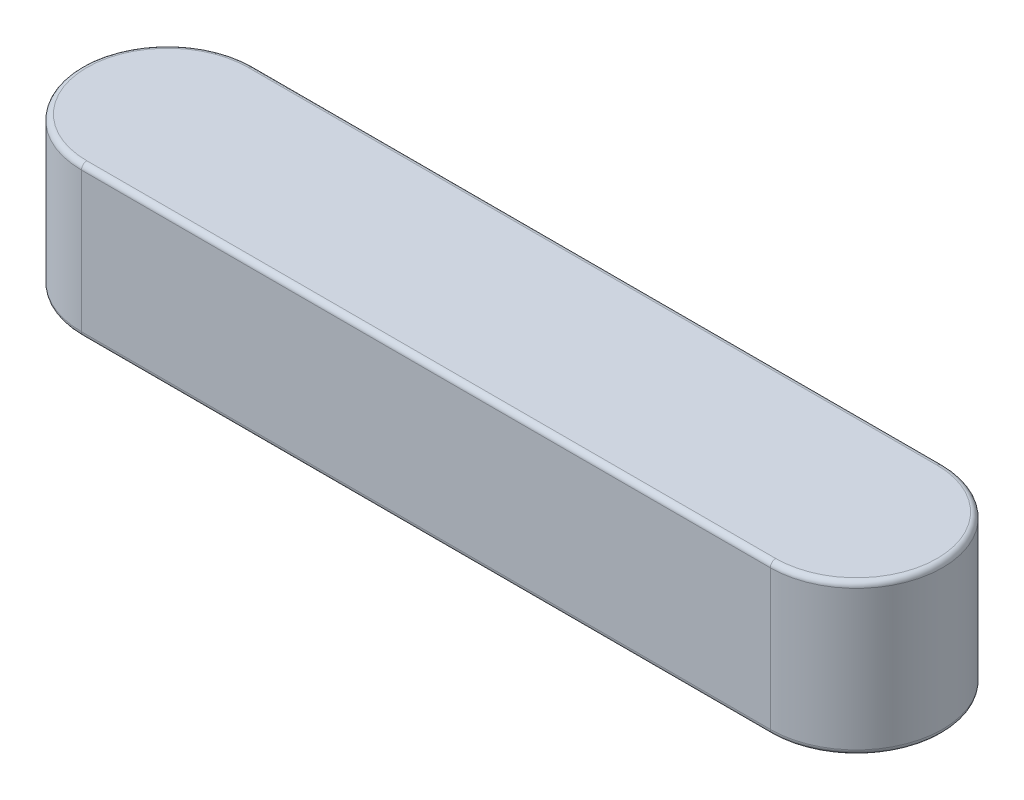
ISO-10303-21;
HEADER;
FILE_DESCRIPTION(('STEP AP214'),'2;1');
FILE_NAME('part.step','',(''),(''),'','','');
FILE_SCHEMA(('AUTOMOTIVE_DESIGN { 1 0 10303 214 1 1 1 1 }'));
ENDSEC;
DATA;
#1=APPLICATION_CONTEXT('core data for automotive mechanical design processes');
#2=APPLICATION_PROTOCOL_DEFINITION('international standard','automotive_design',2000,#1);
#3=PRODUCT_CONTEXT('',#1,'mechanical');
#4=PRODUCT('Part','Part','',(#3));
#5=PRODUCT_RELATED_PRODUCT_CATEGORY('part','',(#4));
#6=PRODUCT_DEFINITION_FORMATION('','',#4);
#7=PRODUCT_DEFINITION_CONTEXT('part definition',#1,'design');
#8=PRODUCT_DEFINITION('design','',#6,#7);
#9=PRODUCT_DEFINITION_SHAPE('','',#8);
#10=(LENGTH_UNIT() NAMED_UNIT(*) SI_UNIT(.MILLI.,.METRE.));
#11=(NAMED_UNIT(*) PLANE_ANGLE_UNIT() SI_UNIT($,.RADIAN.));
#12=(NAMED_UNIT(*) SI_UNIT($,.STERADIAN.) SOLID_ANGLE_UNIT());
#13=UNCERTAINTY_MEASURE_WITH_UNIT(LENGTH_MEASURE(1.E-05),#10,'distance_accuracy_value','');
#14=(GEOMETRIC_REPRESENTATION_CONTEXT(3) GLOBAL_UNCERTAINTY_ASSIGNED_CONTEXT((#13)) GLOBAL_UNIT_ASSIGNED_CONTEXT((#10,
#11,#12)) REPRESENTATION_CONTEXT('',''));
#15=CARTESIAN_POINT('',(0.,0.,0.));
#16=DIRECTION('',(0.,0.,1.));
#17=DIRECTION('',(1.,0.,0.));
#18=AXIS2_PLACEMENT_3D('',#15,#16,#17);
#19=CARTESIAN_POINT('',(-32.,7.,0.));
#20=DIRECTION('',(0.,-1.,0.));
#21=DIRECTION('',(0.,0.,-1.));
#22=AXIS2_PLACEMENT_3D('',#19,#20,#21);
#23=CYLINDRICAL_SURFACE('',#22,4.);
#24=DIRECTION('',(0.,-1.,0.));
#25=VECTOR('',#24,1.);
#26=CARTESIAN_POINT('',(-32.,7.,-4.));
#27=LINE('',#26,#25);
#28=CARTESIAN_POINT('',(-32.,6.75,-4.));
#29=VERTEX_POINT('',#28);
#30=CARTESIAN_POINT('',(-32.,0.25,-4.));
#31=VERTEX_POINT('',#30);
#32=EDGE_CURVE('E104',#29,#31,#27,.T.);
#33=ORIENTED_EDGE('',*,*,#32,.T.);
#34=CARTESIAN_POINT('',(-32.,0.25,0.));
#35=DIRECTION('',(0.,1.,0.));
#36=DIRECTION('',(0.,0.,1.));
#37=AXIS2_PLACEMENT_3D('',#34,#35,#36);
#38=CIRCLE('',#37,4.);
#39=CARTESIAN_POINT('',(-32.,0.25,4.));
#40=VERTEX_POINT('',#39);
#41=EDGE_CURVE('E111',#31,#40,#38,.T.);
#42=ORIENTED_EDGE('',*,*,#41,.T.);
#43=DIRECTION('',(0.,-1.,0.));
#44=VECTOR('',#43,1.);
#45=CARTESIAN_POINT('',(-32.,7.,4.));
#46=LINE('',#45,#44);
#47=CARTESIAN_POINT('',(-32.,6.75,4.));
#48=VERTEX_POINT('',#47);
#49=EDGE_CURVE('E106',#48,#40,#46,.T.);
#50=ORIENTED_EDGE('',*,*,#49,.F.);
#51=CARTESIAN_POINT('',(-32.,6.75,0.));
#52=DIRECTION('',(0.,1.,0.));
#53=DIRECTION('',(0.,0.,1.));
#54=AXIS2_PLACEMENT_3D('',#51,#52,#53);
#55=CIRCLE('',#54,4.);
#56=EDGE_CURVE('E102',#48,#29,#55,.F.);
#57=ORIENTED_EDGE('',*,*,#56,.T.);
#58=EDGE_LOOP('',(#33,#42,#50,#57));
#59=FACE_BOUND('',#58,.T.);
#60=ADVANCED_FACE('F33',(#59),#23,.T.);
#61=CARTESIAN_POINT('',(-32.,7.,4.));
#62=DIRECTION('',(0.,0.,-1.));
#63=DIRECTION('',(-1.,0.,0.));
#64=AXIS2_PLACEMENT_3D('',#61,#62,#63);
#65=PLANE('',#64);
#66=ORIENTED_EDGE('',*,*,#49,.T.);
#67=DIRECTION('',(1.,0.,0.));
#68=VECTOR('',#67,1.);
#69=CARTESIAN_POINT('',(-32.,0.25,4.));
#70=LINE('',#69,#68);
#71=CARTESIAN_POINT('',(0.,0.25,4.));
#72=VERTEX_POINT('',#71);
#73=EDGE_CURVE('E155',#40,#72,#70,.T.);
#74=ORIENTED_EDGE('',*,*,#73,.T.);
#75=DIRECTION('',(0.,-1.,0.));
#76=VECTOR('',#75,1.);
#77=CARTESIAN_POINT('',(0.,7.,4.));
#78=LINE('',#77,#76);
#79=CARTESIAN_POINT('',(0.,6.75,4.));
#80=VERTEX_POINT('',#79);
#81=EDGE_CURVE('E136',#80,#72,#78,.T.);
#82=ORIENTED_EDGE('',*,*,#81,.F.);
#83=DIRECTION('',(1.,0.,0.));
#84=VECTOR('',#83,1.);
#85=CARTESIAN_POINT('',(-32.,6.75,4.));
#86=LINE('',#85,#84);
#87=EDGE_CURVE('E153',#80,#48,#86,.F.);
#88=ORIENTED_EDGE('',*,*,#87,.T.);
#89=EDGE_LOOP('',(#66,#74,#82,#88));
#90=FACE_BOUND('',#89,.T.);
#91=ADVANCED_FACE('F181',(#90),#65,.F.);
#92=CARTESIAN_POINT('',(0.,7.,0.));
#93=DIRECTION('',(0.,-1.,0.));
#94=DIRECTION('',(0.,0.,-1.));
#95=AXIS2_PLACEMENT_3D('',#92,#93,#94);
#96=CYLINDRICAL_SURFACE('',#95,4.);
#97=ORIENTED_EDGE('',*,*,#81,.T.);
#98=CARTESIAN_POINT('',(0.,0.25,0.));
#99=DIRECTION('',(0.,1.,0.));
#100=DIRECTION('',(0.,0.,1.));
#101=AXIS2_PLACEMENT_3D('',#98,#99,#100);
#102=CIRCLE('',#101,4.);
#103=CARTESIAN_POINT('',(0.,0.25,-4.));
#104=VERTEX_POINT('',#103);
#105=EDGE_CURVE('E112',#72,#104,#102,.T.);
#106=ORIENTED_EDGE('',*,*,#105,.T.);
#107=DIRECTION('',(0.,-1.,0.));
#108=VECTOR('',#107,1.);
#109=CARTESIAN_POINT('',(0.,7.,-4.));
#110=LINE('',#109,#108);
#111=CARTESIAN_POINT('',(0.,6.75,-4.));
#112=VERTEX_POINT('',#111);
#113=EDGE_CURVE('E123',#112,#104,#110,.T.);
#114=ORIENTED_EDGE('',*,*,#113,.F.);
#115=CARTESIAN_POINT('',(0.,6.75,0.));
#116=DIRECTION('',(0.,1.,0.));
#117=DIRECTION('',(0.,0.,1.));
#118=AXIS2_PLACEMENT_3D('',#115,#116,#117);
#119=CIRCLE('',#118,4.);
#120=EDGE_CURVE('E148',#112,#80,#119,.F.);
#121=ORIENTED_EDGE('',*,*,#120,.T.);
#122=EDGE_LOOP('',(#97,#106,#114,#121));
#123=FACE_BOUND('',#122,.T.);
#124=ADVANCED_FACE('F179',(#123),#96,.T.);
#125=CARTESIAN_POINT('',(-32.,7.,-4.));
#126=DIRECTION('',(0.,0.,1.));
#127=DIRECTION('',(1.,0.,0.));
#128=AXIS2_PLACEMENT_3D('',#125,#126,#127);
#129=PLANE('',#128);
#130=ORIENTED_EDGE('',*,*,#113,.T.);
#131=DIRECTION('',(-1.,0.,0.));
#132=VECTOR('',#131,1.);
#133=CARTESIAN_POINT('',(-32.,0.25,-4.));
#134=LINE('',#133,#132);
#135=EDGE_CURVE('E122',#104,#31,#134,.T.);
#136=ORIENTED_EDGE('',*,*,#135,.T.);
#137=ORIENTED_EDGE('',*,*,#32,.F.);
#138=DIRECTION('',(-1.,0.,0.));
#139=VECTOR('',#138,1.);
#140=CARTESIAN_POINT('',(0.,6.75,-4.));
#141=LINE('',#140,#139);
#142=EDGE_CURVE('E119',#29,#112,#141,.F.);
#143=ORIENTED_EDGE('',*,*,#142,.T.);
#144=EDGE_LOOP('',(#130,#136,#137,#143));
#145=FACE_BOUND('',#144,.T.);
#146=ADVANCED_FACE('F117',(#145),#129,.F.);
#147=CARTESIAN_POINT('',(-32.,7.,0.));
#148=DIRECTION('',(0.,1.,0.));
#149=DIRECTION('',(0.,0.,1.));
#150=AXIS2_PLACEMENT_3D('',#147,#148,#149);
#151=PLANE('',#150);
#152=DIRECTION('',(1.,0.,0.));
#153=VECTOR('',#152,1.);
#154=CARTESIAN_POINT('',(0.,7.,3.75));
#155=LINE('',#154,#153);
#156=CARTESIAN_POINT('',(-32.,7.,3.75));
#157=VERTEX_POINT('',#156);
#158=CARTESIAN_POINT('',(0.,7.,3.75));
#159=VERTEX_POINT('',#158);
#160=EDGE_CURVE('E42',#157,#159,#155,.T.);
#161=ORIENTED_EDGE('',*,*,#160,.T.);
#162=CARTESIAN_POINT('',(0.,7.,0.));
#163=DIRECTION('',(0.,1.,0.));
#164=DIRECTION('',(0.,0.,1.));
#165=AXIS2_PLACEMENT_3D('',#162,#163,#164);
#166=CIRCLE('',#165,3.75);
#167=CARTESIAN_POINT('',(0.,7.,-3.75));
#168=VERTEX_POINT('',#167);
#169=EDGE_CURVE('E11',#159,#168,#166,.T.);
#170=ORIENTED_EDGE('',*,*,#169,.T.);
#171=DIRECTION('',(-1.,0.,0.));
#172=VECTOR('',#171,1.);
#173=CARTESIAN_POINT('',(-32.,7.,-3.75));
#174=LINE('',#173,#172);
#175=CARTESIAN_POINT('',(-32.,7.,-3.75));
#176=VERTEX_POINT('',#175);
#177=EDGE_CURVE('E158',#168,#176,#174,.T.);
#178=ORIENTED_EDGE('',*,*,#177,.T.);
#179=CARTESIAN_POINT('',(-32.,7.,0.));
#180=DIRECTION('',(0.,1.,0.));
#181=DIRECTION('',(0.,0.,1.));
#182=AXIS2_PLACEMENT_3D('',#179,#180,#181);
#183=CIRCLE('',#182,3.75);
#184=EDGE_CURVE('E129',#176,#157,#183,.T.);
#185=ORIENTED_EDGE('',*,*,#184,.T.);
#186=EDGE_LOOP('',(#161,#170,#178,#185));
#187=FACE_BOUND('',#186,.T.);
#188=ADVANCED_FACE('F204',(#187),#151,.T.);
#189=CARTESIAN_POINT('',(-32.,0.,0.));
#190=DIRECTION('',(0.,1.,0.));
#191=DIRECTION('',(0.,0.,1.));
#192=AXIS2_PLACEMENT_3D('',#189,#190,#191);
#193=PLANE('',#192);
#194=CARTESIAN_POINT('',(-32.,0.,0.));
#195=DIRECTION('',(0.,1.,0.));
#196=DIRECTION('',(0.,0.,1.));
#197=AXIS2_PLACEMENT_3D('',#194,#195,#196);
#198=CIRCLE('',#197,3.75);
#199=CARTESIAN_POINT('',(-32.,0.,3.75));
#200=VERTEX_POINT('',#199);
#201=CARTESIAN_POINT('',(-32.,0.,-3.75));
#202=VERTEX_POINT('',#201);
#203=EDGE_CURVE('E141',#200,#202,#198,.F.);
#204=ORIENTED_EDGE('',*,*,#203,.T.);
#205=DIRECTION('',(-1.,0.,0.));
#206=VECTOR('',#205,1.);
#207=CARTESIAN_POINT('',(-32.,0.,-3.75));
#208=LINE('',#207,#206);
#209=CARTESIAN_POINT('',(0.,0.,-3.75));
#210=VERTEX_POINT('',#209);
#211=EDGE_CURVE('E145',#202,#210,#208,.F.);
#212=ORIENTED_EDGE('',*,*,#211,.T.);
#213=CARTESIAN_POINT('',(0.,0.,0.));
#214=DIRECTION('',(0.,1.,0.));
#215=DIRECTION('',(0.,0.,1.));
#216=AXIS2_PLACEMENT_3D('',#213,#214,#215);
#217=CIRCLE('',#216,3.75);
#218=CARTESIAN_POINT('',(0.,0.,3.75));
#219=VERTEX_POINT('',#218);
#220=EDGE_CURVE('E143',#210,#219,#217,.F.);
#221=ORIENTED_EDGE('',*,*,#220,.T.);
#222=DIRECTION('',(1.,0.,0.));
#223=VECTOR('',#222,1.);
#224=CARTESIAN_POINT('',(-32.,0.,3.75));
#225=LINE('',#224,#223);
#226=EDGE_CURVE('E134',#219,#200,#225,.F.);
#227=ORIENTED_EDGE('',*,*,#226,.T.);
#228=EDGE_LOOP('',(#204,#212,#221,#227));
#229=FACE_BOUND('',#228,.T.);
#230=ADVANCED_FACE('F202',(#229),#193,.F.);
#231=CARTESIAN_POINT('',(-32.,0.25,3.75));
#232=DIRECTION('',(1.,0.,0.));
#233=DIRECTION('',(0.,0.,-1.));
#234=AXIS2_PLACEMENT_3D('',#231,#232,#233);
#235=CYLINDRICAL_SURFACE('',#234,0.25);
#236=CARTESIAN_POINT('',(-32.,0.25,3.75));
#237=DIRECTION('',(-1.,0.,0.));
#238=DIRECTION('',(0.,0.,1.));
#239=AXIS2_PLACEMENT_3D('',#236,#237,#238);
#240=CIRCLE('',#239,0.25);
#241=EDGE_CURVE('E165',#200,#40,#240,.T.);
#242=ORIENTED_EDGE('',*,*,#241,.F.);
#243=ORIENTED_EDGE('',*,*,#226,.F.);
#244=CARTESIAN_POINT('',(0.,0.25,3.75));
#245=DIRECTION('',(1.,0.,0.));
#246=DIRECTION('',(0.,0.,-1.));
#247=AXIS2_PLACEMENT_3D('',#244,#245,#246);
#248=CIRCLE('',#247,0.25);
#249=EDGE_CURVE('E124',#72,#219,#248,.T.);
#250=ORIENTED_EDGE('',*,*,#249,.F.);
#251=ORIENTED_EDGE('',*,*,#73,.F.);
#252=EDGE_LOOP('',(#242,#243,#250,#251));
#253=FACE_BOUND('',#252,.T.);
#254=ADVANCED_FACE('F199',(#253),#235,.T.);
#255=CARTESIAN_POINT('',(0.,0.25,0.));
#256=DIRECTION('',(0.,1.,0.));
#257=DIRECTION('',(0.,0.,1.));
#258=AXIS2_PLACEMENT_3D('',#255,#256,#257);
#259=TOROIDAL_SURFACE('',#258,3.75,0.25);
#260=ORIENTED_EDGE('',*,*,#249,.T.);
#261=ORIENTED_EDGE('',*,*,#220,.F.);
#262=CARTESIAN_POINT('',(0.,0.25,-3.75));
#263=DIRECTION('',(-1.,0.,0.));
#264=DIRECTION('',(0.,0.,1.));
#265=AXIS2_PLACEMENT_3D('',#262,#263,#264);
#266=CIRCLE('',#265,0.25);
#267=EDGE_CURVE('E163',#104,#210,#266,.T.);
#268=ORIENTED_EDGE('',*,*,#267,.F.);
#269=ORIENTED_EDGE('',*,*,#105,.F.);
#270=EDGE_LOOP('',(#260,#261,#268,#269));
#271=FACE_BOUND('',#270,.T.);
#272=ADVANCED_FACE('F188',(#271),#259,.T.);
#273=CARTESIAN_POINT('',(-32.,0.25,0.));
#274=DIRECTION('',(0.,1.,0.));
#275=DIRECTION('',(0.,0.,1.));
#276=AXIS2_PLACEMENT_3D('',#273,#274,#275);
#277=TOROIDAL_SURFACE('',#276,3.75,0.25);
#278=ORIENTED_EDGE('',*,*,#241,.T.);
#279=ORIENTED_EDGE('',*,*,#41,.F.);
#280=CARTESIAN_POINT('',(-32.,0.25,-3.75));
#281=DIRECTION('',(1.,0.,0.));
#282=DIRECTION('',(0.,0.,-1.));
#283=AXIS2_PLACEMENT_3D('',#280,#281,#282);
#284=CIRCLE('',#283,0.25);
#285=EDGE_CURVE('E161',#202,#31,#284,.T.);
#286=ORIENTED_EDGE('',*,*,#285,.F.);
#287=ORIENTED_EDGE('',*,*,#203,.F.);
#288=EDGE_LOOP('',(#278,#279,#286,#287));
#289=FACE_BOUND('',#288,.T.);
#290=ADVANCED_FACE('F196',(#289),#277,.T.);
#291=CARTESIAN_POINT('',(-32.,0.25,-3.75));
#292=DIRECTION('',(-1.,0.,0.));
#293=DIRECTION('',(0.,0.,1.));
#294=AXIS2_PLACEMENT_3D('',#291,#292,#293);
#295=CYLINDRICAL_SURFACE('',#294,0.25);
#296=ORIENTED_EDGE('',*,*,#267,.T.);
#297=ORIENTED_EDGE('',*,*,#211,.F.);
#298=ORIENTED_EDGE('',*,*,#285,.T.);
#299=ORIENTED_EDGE('',*,*,#135,.F.);
#300=EDGE_LOOP('',(#296,#297,#298,#299));
#301=FACE_BOUND('',#300,.T.);
#302=ADVANCED_FACE('F191',(#301),#295,.T.);
#303=CARTESIAN_POINT('',(-32.,6.75,0.));
#304=DIRECTION('',(0.,1.,0.));
#305=DIRECTION('',(0.,0.,1.));
#306=AXIS2_PLACEMENT_3D('',#303,#304,#305);
#307=TOROIDAL_SURFACE('',#306,3.75,0.25);
#308=CARTESIAN_POINT('',(-32.,6.75,-3.75));
#309=DIRECTION('',(1.,0.,0.));
#310=DIRECTION('',(0.,0.,-1.));
#311=AXIS2_PLACEMENT_3D('',#308,#309,#310);
#312=CIRCLE('',#311,0.25);
#313=EDGE_CURVE('E128',#29,#176,#312,.T.);
#314=ORIENTED_EDGE('',*,*,#313,.F.);
#315=ORIENTED_EDGE('',*,*,#56,.F.);
#316=CARTESIAN_POINT('',(-32.,6.75,3.75));
#317=DIRECTION('',(1.,0.,0.));
#318=DIRECTION('',(0.,0.,-1.));
#319=AXIS2_PLACEMENT_3D('',#316,#317,#318);
#320=CIRCLE('',#319,0.25);
#321=EDGE_CURVE('E37',#157,#48,#320,.T.);
#322=ORIENTED_EDGE('',*,*,#321,.F.);
#323=ORIENTED_EDGE('',*,*,#184,.F.);
#324=EDGE_LOOP('',(#314,#315,#322,#323));
#325=FACE_BOUND('',#324,.T.);
#326=ADVANCED_FACE('F35',(#325),#307,.T.);
#327=CARTESIAN_POINT('',(-32.,6.75,3.75));
#328=DIRECTION('',(-1.,0.,0.));
#329=DIRECTION('',(0.,0.,1.));
#330=AXIS2_PLACEMENT_3D('',#327,#328,#329);
#331=CYLINDRICAL_SURFACE('',#330,0.25);
#332=ORIENTED_EDGE('',*,*,#321,.T.);
#333=ORIENTED_EDGE('',*,*,#87,.F.);
#334=CARTESIAN_POINT('',(0.,6.75,3.75));
#335=DIRECTION('',(1.,0.,0.));
#336=DIRECTION('',(0.,0.,-1.));
#337=AXIS2_PLACEMENT_3D('',#334,#335,#336);
#338=CIRCLE('',#337,0.25);
#339=EDGE_CURVE('E131',#159,#80,#338,.T.);
#340=ORIENTED_EDGE('',*,*,#339,.F.);
#341=ORIENTED_EDGE('',*,*,#160,.F.);
#342=EDGE_LOOP('',(#332,#333,#340,#341));
#343=FACE_BOUND('',#342,.T.);
#344=ADVANCED_FACE('F174',(#343),#331,.T.);
#345=CARTESIAN_POINT('',(-32.,6.75,-3.75));
#346=DIRECTION('',(1.,0.,0.));
#347=DIRECTION('',(0.,0.,-1.));
#348=AXIS2_PLACEMENT_3D('',#345,#346,#347);
#349=CYLINDRICAL_SURFACE('',#348,0.25);
#350=ORIENTED_EDGE('',*,*,#313,.T.);
#351=ORIENTED_EDGE('',*,*,#177,.F.);
#352=CARTESIAN_POINT('',(0.,6.75,-3.75));
#353=DIRECTION('',(1.,0.,0.));
#354=DIRECTION('',(0.,0.,-1.));
#355=AXIS2_PLACEMENT_3D('',#352,#353,#354);
#356=CIRCLE('',#355,0.25);
#357=EDGE_CURVE('E56',#112,#168,#356,.T.);
#358=ORIENTED_EDGE('',*,*,#357,.F.);
#359=ORIENTED_EDGE('',*,*,#142,.F.);
#360=EDGE_LOOP('',(#350,#351,#358,#359));
#361=FACE_BOUND('',#360,.T.);
#362=ADVANCED_FACE('F132',(#361),#349,.T.);
#363=CARTESIAN_POINT('',(0.,6.75,0.));
#364=DIRECTION('',(0.,1.,0.));
#365=DIRECTION('',(0.,0.,1.));
#366=AXIS2_PLACEMENT_3D('',#363,#364,#365);
#367=TOROIDAL_SURFACE('',#366,3.75,0.25);
#368=ORIENTED_EDGE('',*,*,#339,.T.);
#369=ORIENTED_EDGE('',*,*,#120,.F.);
#370=ORIENTED_EDGE('',*,*,#357,.T.);
#371=ORIENTED_EDGE('',*,*,#169,.F.);
#372=EDGE_LOOP('',(#368,#369,#370,#371));
#373=FACE_BOUND('',#372,.T.);
#374=ADVANCED_FACE('F172',(#373),#367,.T.);
#375=CLOSED_SHELL('',(#60,#91,#124,#146,#188,#230,#254,#272,#290,#302,#326,#344,#362,#374));
#376=MANIFOLD_SOLID_BREP('B2',#375);
#377=ADVANCED_BREP_SHAPE_REPRESENTATION('',(#18,#376),#14);
#378=SHAPE_DEFINITION_REPRESENTATION(#9,#377);
ENDSEC;
END-ISO-10303-21;
